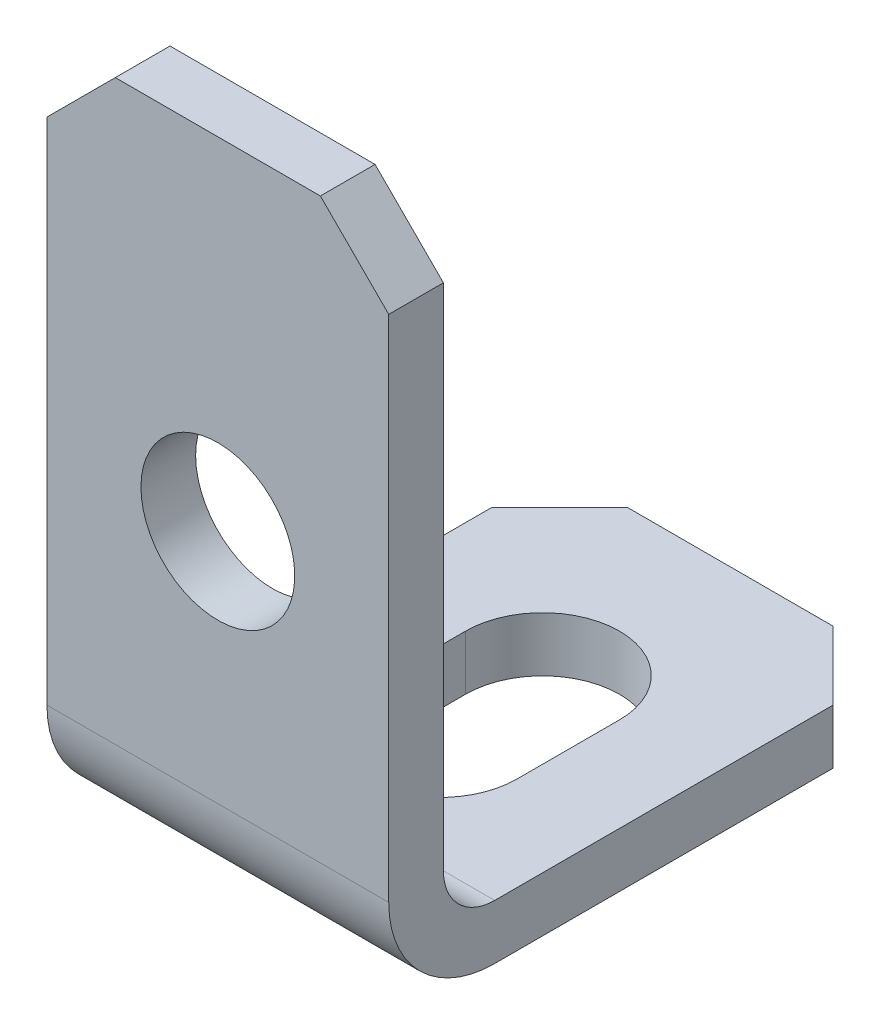
ISO-10303-21;
HEADER;
FILE_DESCRIPTION(('STEP AP214'),'2;1');
FILE_NAME('part.step','',(''),(''),'','','');
FILE_SCHEMA(('AUTOMOTIVE_DESIGN { 1 0 10303 214 1 1 1 1 }'));
ENDSEC;
DATA;
#1=APPLICATION_CONTEXT('core data for automotive mechanical design processes');
#2=APPLICATION_PROTOCOL_DEFINITION('international standard','automotive_design',2000,#1);
#3=PRODUCT_CONTEXT('',#1,'mechanical');
#4=PRODUCT('Part','Part','',(#3));
#5=PRODUCT_RELATED_PRODUCT_CATEGORY('part','',(#4));
#6=PRODUCT_DEFINITION_FORMATION('','',#4);
#7=PRODUCT_DEFINITION_CONTEXT('part definition',#1,'design');
#8=PRODUCT_DEFINITION('design','',#6,#7);
#9=PRODUCT_DEFINITION_SHAPE('','',#8);
#10=(LENGTH_UNIT() NAMED_UNIT(*) SI_UNIT(.MILLI.,.METRE.));
#11=(NAMED_UNIT(*) PLANE_ANGLE_UNIT() SI_UNIT($,.RADIAN.));
#12=(NAMED_UNIT(*) SI_UNIT($,.STERADIAN.) SOLID_ANGLE_UNIT());
#13=UNCERTAINTY_MEASURE_WITH_UNIT(LENGTH_MEASURE(1.E-05),#10,'distance_accuracy_value','');
#14=(GEOMETRIC_REPRESENTATION_CONTEXT(3) GLOBAL_UNCERTAINTY_ASSIGNED_CONTEXT((#13)) GLOBAL_UNIT_ASSIGNED_CONTEXT((#10,
#11,#12)) REPRESENTATION_CONTEXT('',''));
#15=CARTESIAN_POINT('',(0.,0.,0.));
#16=DIRECTION('',(0.,0.,1.));
#17=DIRECTION('',(1.,0.,0.));
#18=AXIS2_PLACEMENT_3D('',#15,#16,#17);
#19=CARTESIAN_POINT('',(0.,20.,-15.));
#20=DIRECTION('',(0.,1.,0.));
#21=DIRECTION('',(0.,0.,1.));
#22=AXIS2_PLACEMENT_3D('',#19,#20,#21);
#23=PLANE('',#22);
#24=DIRECTION('',(-1.,0.,0.));
#25=VECTOR('',#24,1.);
#26=CARTESIAN_POINT('',(10.,20.,-1.6));
#27=LINE('',#26,#25);
#28=CARTESIAN_POINT('',(7.99999999999999,20.,-1.6));
#29=VERTEX_POINT('',#28);
#30=CARTESIAN_POINT('',(2.,20.,-1.6));
#31=VERTEX_POINT('',#30);
#32=EDGE_CURVE('E188',#29,#31,#27,.T.);
#33=ORIENTED_EDGE('',*,*,#32,.T.);
#34=DIRECTION('',(0.,0.,1.));
#35=VECTOR('',#34,1.);
#36=CARTESIAN_POINT('',(1.99999999999999,20.,0.));
#37=LINE('',#36,#35);
#38=CARTESIAN_POINT('',(1.99999999999999,20.,0.));
#39=VERTEX_POINT('',#38);
#40=EDGE_CURVE('E219',#31,#39,#37,.T.);
#41=ORIENTED_EDGE('',*,*,#40,.T.);
#42=DIRECTION('',(1.,0.,0.));
#43=VECTOR('',#42,1.);
#44=CARTESIAN_POINT('',(0.,20.,0.));
#45=LINE('',#44,#43);
#46=CARTESIAN_POINT('',(7.99999999999999,20.,0.));
#47=VERTEX_POINT('',#46);
#48=EDGE_CURVE('E200',#39,#47,#45,.T.);
#49=ORIENTED_EDGE('',*,*,#48,.T.);
#50=DIRECTION('',(0.,0.,-1.));
#51=VECTOR('',#50,1.);
#52=CARTESIAN_POINT('',(7.99999999999999,20.,-15.));
#53=LINE('',#52,#51);
#54=EDGE_CURVE('E217',#47,#29,#53,.T.);
#55=ORIENTED_EDGE('',*,*,#54,.T.);
#56=EDGE_LOOP('',(#33,#41,#49,#55));
#57=FACE_BOUND('',#56,.T.);
#58=ADVANCED_FACE('F32',(#57),#23,.T.);
#59=CARTESIAN_POINT('',(0.,0.,-15.));
#60=DIRECTION('',(0.,0.,-1.));
#61=DIRECTION('',(-1.,0.,0.));
#62=AXIS2_PLACEMENT_3D('',#59,#60,#61);
#63=PLANE('',#62);
#64=DIRECTION('',(1.,0.,0.));
#65=VECTOR('',#64,1.);
#66=CARTESIAN_POINT('',(0.,0.,-15.));
#67=LINE('',#66,#65);
#68=CARTESIAN_POINT('',(1.99999999999999,0.,-15.));
#69=VERTEX_POINT('',#68);
#70=CARTESIAN_POINT('',(7.99999999999999,0.,-15.));
#71=VERTEX_POINT('',#70);
#72=EDGE_CURVE('E203',#69,#71,#67,.T.);
#73=ORIENTED_EDGE('',*,*,#72,.F.);
#74=DIRECTION('',(0.,1.,0.));
#75=VECTOR('',#74,1.);
#76=CARTESIAN_POINT('',(1.99999999999999,1.6,-15.));
#77=LINE('',#76,#75);
#78=CARTESIAN_POINT('',(2.,1.6,-15.));
#79=VERTEX_POINT('',#78);
#80=EDGE_CURVE('E239',#69,#79,#77,.T.);
#81=ORIENTED_EDGE('',*,*,#80,.T.);
#82=DIRECTION('',(-1.,0.,0.));
#83=VECTOR('',#82,1.);
#84=CARTESIAN_POINT('',(10.,1.6,-15.));
#85=LINE('',#84,#83);
#86=CARTESIAN_POINT('',(7.99999999999999,1.6,-15.));
#87=VERTEX_POINT('',#86);
#88=EDGE_CURVE('E184',#87,#79,#85,.T.);
#89=ORIENTED_EDGE('',*,*,#88,.F.);
#90=DIRECTION('',(0.,-1.,0.));
#91=VECTOR('',#90,1.);
#92=CARTESIAN_POINT('',(7.99999999999999,0.,-15.));
#93=LINE('',#92,#91);
#94=EDGE_CURVE('E237',#87,#71,#93,.T.);
#95=ORIENTED_EDGE('',*,*,#94,.T.);
#96=EDGE_LOOP('',(#73,#81,#89,#95));
#97=FACE_BOUND('',#96,.T.);
#98=ADVANCED_FACE('F301',(#97),#63,.T.);
#99=CARTESIAN_POINT('',(0.,0.,0.));
#100=DIRECTION('',(0.,-1.,0.));
#101=DIRECTION('',(0.,0.,-1.));
#102=AXIS2_PLACEMENT_3D('',#99,#100,#101);
#103=PLANE('',#102);
#104=CARTESIAN_POINT('',(5.,0.,-9.5));
#105=DIRECTION('',(0.,-1.,0.));
#106=DIRECTION('',(0.,0.,-1.));
#107=AXIS2_PLACEMENT_3D('',#104,#105,#106);
#108=CIRCLE('',#107,2.25);
#109=CARTESIAN_POINT('',(2.75,0.,-9.5));
#110=VERTEX_POINT('',#109);
#111=CARTESIAN_POINT('',(7.25,0.,-9.5));
#112=VERTEX_POINT('',#111);
#113=EDGE_CURVE('E164',#110,#112,#108,.T.);
#114=ORIENTED_EDGE('',*,*,#113,.F.);
#115=DIRECTION('',(0.,0.,-1.));
#116=VECTOR('',#115,1.);
#117=CARTESIAN_POINT('',(2.75,0.,-6.5));
#118=LINE('',#117,#116);
#119=CARTESIAN_POINT('',(2.75,0.,-6.5));
#120=VERTEX_POINT('',#119);
#121=EDGE_CURVE('E168',#120,#110,#118,.T.);
#122=ORIENTED_EDGE('',*,*,#121,.F.);
#123=CARTESIAN_POINT('',(5.,0.,-6.5));
#124=DIRECTION('',(0.,-1.,0.));
#125=DIRECTION('',(0.,0.,-1.));
#126=AXIS2_PLACEMENT_3D('',#123,#124,#125);
#127=CIRCLE('',#126,2.25);
#128=CARTESIAN_POINT('',(7.25,0.,-6.5));
#129=VERTEX_POINT('',#128);
#130=EDGE_CURVE('E148',#129,#120,#127,.T.);
#131=ORIENTED_EDGE('',*,*,#130,.F.);
#132=DIRECTION('',(0.,0.,1.));
#133=VECTOR('',#132,1.);
#134=CARTESIAN_POINT('',(7.25,0.,-9.5));
#135=LINE('',#134,#133);
#136=EDGE_CURVE('E159',#112,#129,#135,.T.);
#137=ORIENTED_EDGE('',*,*,#136,.F.);
#138=EDGE_LOOP('',(#114,#122,#131,#137));
#139=FACE_BOUND('',#138,.T.);
#140=DIRECTION('',(0.,0.,-1.));
#141=VECTOR('',#140,1.);
#142=CARTESIAN_POINT('',(10.,0.,0.));
#143=LINE('',#142,#141);
#144=CARTESIAN_POINT('',(10.,0.,-3.1));
#145=VERTEX_POINT('',#144);
#146=CARTESIAN_POINT('',(10.,0.,-13.));
#147=VERTEX_POINT('',#146);
#148=EDGE_CURVE('E198',#145,#147,#143,.T.);
#149=ORIENTED_EDGE('',*,*,#148,.F.);
#150=DIRECTION('',(1.,0.,0.));
#151=VECTOR('',#150,1.);
#152=CARTESIAN_POINT('',(0.,0.,-3.1));
#153=LINE('',#152,#151);
#154=CARTESIAN_POINT('',(0.,0.,-3.1));
#155=VERTEX_POINT('',#154);
#156=EDGE_CURVE('E40',#145,#155,#153,.F.);
#157=ORIENTED_EDGE('',*,*,#156,.T.);
#158=DIRECTION('',(0.,0.,-1.));
#159=VECTOR('',#158,1.);
#160=CARTESIAN_POINT('',(0.,0.,0.));
#161=LINE('',#160,#159);
#162=CARTESIAN_POINT('',(0.,0.,-13.));
#163=VERTEX_POINT('',#162);
#164=EDGE_CURVE('E197',#155,#163,#161,.T.);
#165=ORIENTED_EDGE('',*,*,#164,.T.);
#166=DIRECTION('',(0.707106781186545,0.,-0.70710678118655));
#167=VECTOR('',#166,1.);
#168=CARTESIAN_POINT('',(-6.5,0.,-6.49999999999995));
#169=LINE('',#168,#167);
#170=EDGE_CURVE('E249',#163,#69,#169,.T.);
#171=ORIENTED_EDGE('',*,*,#170,.T.);
#172=ORIENTED_EDGE('',*,*,#72,.T.);
#173=DIRECTION('',(-0.70710678118655,0.,-0.707106781186545));
#174=VECTOR('',#173,1.);
#175=CARTESIAN_POINT('',(11.5,0.,-11.5));
#176=LINE('',#175,#174);
#177=EDGE_CURVE('E246',#71,#147,#176,.F.);
#178=ORIENTED_EDGE('',*,*,#177,.T.);
#179=EDGE_LOOP('',(#149,#157,#165,#171,#172,#178));
#180=FACE_BOUND('',#179,.T.);
#181=ADVANCED_FACE('F166',(#139,#180),#103,.T.);
#182=CARTESIAN_POINT('',(0.,20.,0.));
#183=DIRECTION('',(0.,0.,1.));
#184=DIRECTION('',(1.,0.,0.));
#185=AXIS2_PLACEMENT_3D('',#182,#183,#184);
#186=PLANE('',#185);
#187=CARTESIAN_POINT('',(5.,10.,0.));
#188=DIRECTION('',(0.,0.,-1.));
#189=DIRECTION('',(-1.,0.,0.));
#190=AXIS2_PLACEMENT_3D('',#187,#188,#189);
#191=CIRCLE('',#190,2.24999999999999);
#192=CARTESIAN_POINT('',(2.75000000000001,10.,0.));
#193=VERTEX_POINT('',#192);
#194=EDGE_CURVE('E466',#193,#193,#191,.T.);
#195=ORIENTED_EDGE('',*,*,#194,.T.);
#196=EDGE_LOOP('',(#195));
#197=FACE_BOUND('',#196,.T.);
#198=DIRECTION('',(0.,-1.,0.));
#199=VECTOR('',#198,1.);
#200=CARTESIAN_POINT('',(0.,20.,0.));
#201=LINE('',#200,#199);
#202=CARTESIAN_POINT('',(0.,18.,0.));
#203=VERTEX_POINT('',#202);
#204=CARTESIAN_POINT('',(0.,3.1,0.));
#205=VERTEX_POINT('',#204);
#206=EDGE_CURVE('E194',#203,#205,#201,.T.);
#207=ORIENTED_EDGE('',*,*,#206,.T.);
#208=DIRECTION('',(1.,0.,0.));
#209=VECTOR('',#208,1.);
#210=CARTESIAN_POINT('',(0.,3.1,0.));
#211=LINE('',#210,#209);
#212=CARTESIAN_POINT('',(10.,3.1,0.));
#213=VERTEX_POINT('',#212);
#214=EDGE_CURVE('E266',#205,#213,#211,.T.);
#215=ORIENTED_EDGE('',*,*,#214,.T.);
#216=DIRECTION('',(0.,-1.,0.));
#217=VECTOR('',#216,1.);
#218=CARTESIAN_POINT('',(10.,20.,0.));
#219=LINE('',#218,#217);
#220=CARTESIAN_POINT('',(10.,18.,0.));
#221=VERTEX_POINT('',#220);
#222=EDGE_CURVE('E191',#221,#213,#219,.T.);
#223=ORIENTED_EDGE('',*,*,#222,.F.);
#224=DIRECTION('',(0.70710678118655,-0.707106781186545,0.));
#225=VECTOR('',#224,1.);
#226=CARTESIAN_POINT('',(3.99999999999997,24.,0.));
#227=LINE('',#226,#225);
#228=EDGE_CURVE('E222',#221,#47,#227,.F.);
#229=ORIENTED_EDGE('',*,*,#228,.T.);
#230=ORIENTED_EDGE('',*,*,#48,.F.);
#231=DIRECTION('',(-0.707106781186545,-0.70710678118655,0.));
#232=VECTOR('',#231,1.);
#233=CARTESIAN_POINT('',(1.,19.,0.));
#234=LINE('',#233,#232);
#235=EDGE_CURVE('E224',#39,#203,#234,.T.);
#236=ORIENTED_EDGE('',*,*,#235,.T.);
#237=EDGE_LOOP('',(#207,#215,#223,#229,#230,#236));
#238=FACE_BOUND('',#237,.T.);
#239=ADVANCED_FACE('F272',(#197,#238),#186,.T.);
#240=CARTESIAN_POINT('',(0.,0.,0.));
#241=DIRECTION('',(1.,0.,0.));
#242=DIRECTION('',(0.,0.,-1.));
#243=AXIS2_PLACEMENT_3D('',#240,#241,#242);
#244=PLANE('',#243);
#245=ORIENTED_EDGE('',*,*,#164,.F.);
#246=CARTESIAN_POINT('',(0.,3.1,-3.1));
#247=DIRECTION('',(1.,0.,0.));
#248=DIRECTION('',(0.,0.,-1.));
#249=AXIS2_PLACEMENT_3D('',#246,#247,#248);
#250=CIRCLE('',#249,3.1);
#251=EDGE_CURVE('E11',#155,#205,#250,.F.);
#252=ORIENTED_EDGE('',*,*,#251,.T.);
#253=ORIENTED_EDGE('',*,*,#206,.F.);
#254=DIRECTION('',(0.,0.,-1.));
#255=VECTOR('',#254,1.);
#256=CARTESIAN_POINT('',(0.,18.,-1.6));
#257=LINE('',#256,#255);
#258=CARTESIAN_POINT('',(0.,18.,-1.6));
#259=VERTEX_POINT('',#258);
#260=EDGE_CURVE('E229',#203,#259,#257,.T.);
#261=ORIENTED_EDGE('',*,*,#260,.T.);
#262=DIRECTION('',(0.,1.,0.));
#263=VECTOR('',#262,1.);
#264=CARTESIAN_POINT('',(0.,1.6,-1.6));
#265=LINE('',#264,#263);
#266=CARTESIAN_POINT('',(0.,3.1,-1.6));
#267=VERTEX_POINT('',#266);
#268=EDGE_CURVE('E182',#267,#259,#265,.T.);
#269=ORIENTED_EDGE('',*,*,#268,.F.);
#270=CARTESIAN_POINT('',(0.,3.1,-3.1));
#271=DIRECTION('',(1.,0.,0.));
#272=DIRECTION('',(0.,0.,-1.));
#273=AXIS2_PLACEMENT_3D('',#270,#271,#272);
#274=CIRCLE('',#273,1.5);
#275=CARTESIAN_POINT('',(0.,1.6,-3.1));
#276=VERTEX_POINT('',#275);
#277=EDGE_CURVE('E262',#267,#276,#274,.T.);
#278=ORIENTED_EDGE('',*,*,#277,.T.);
#279=DIRECTION('',(0.,0.,1.));
#280=VECTOR('',#279,1.);
#281=CARTESIAN_POINT('',(0.,1.6,-15.));
#282=LINE('',#281,#280);
#283=CARTESIAN_POINT('',(0.,1.6,-13.));
#284=VERTEX_POINT('',#283);
#285=EDGE_CURVE('E175',#284,#276,#282,.T.);
#286=ORIENTED_EDGE('',*,*,#285,.F.);
#287=DIRECTION('',(0.,-1.,0.));
#288=VECTOR('',#287,1.);
#289=CARTESIAN_POINT('',(0.,0.,-13.));
#290=LINE('',#289,#288);
#291=EDGE_CURVE('E226',#284,#163,#290,.T.);
#292=ORIENTED_EDGE('',*,*,#291,.T.);
#293=EDGE_LOOP('',(#245,#252,#253,#261,#269,#278,#286,#292));
#294=FACE_BOUND('',#293,.T.);
#295=ADVANCED_FACE('F292',(#294),#244,.F.);
#296=CARTESIAN_POINT('',(10.,0.,0.));
#297=DIRECTION('',(1.,0.,0.));
#298=DIRECTION('',(0.,0.,-1.));
#299=AXIS2_PLACEMENT_3D('',#296,#297,#298);
#300=PLANE('',#299);
#301=ORIENTED_EDGE('',*,*,#222,.T.);
#302=CARTESIAN_POINT('',(10.,3.1,-3.1));
#303=DIRECTION('',(1.,0.,0.));
#304=DIRECTION('',(0.,0.,-1.));
#305=AXIS2_PLACEMENT_3D('',#302,#303,#304);
#306=CIRCLE('',#305,3.1);
#307=EDGE_CURVE('E54',#213,#145,#306,.T.);
#308=ORIENTED_EDGE('',*,*,#307,.T.);
#309=ORIENTED_EDGE('',*,*,#148,.T.);
#310=DIRECTION('',(0.,1.,0.));
#311=VECTOR('',#310,1.);
#312=CARTESIAN_POINT('',(10.,0.,-13.));
#313=LINE('',#312,#311);
#314=CARTESIAN_POINT('',(10.,1.6,-13.));
#315=VERTEX_POINT('',#314);
#316=EDGE_CURVE('E254',#147,#315,#313,.T.);
#317=ORIENTED_EDGE('',*,*,#316,.T.);
#318=DIRECTION('',(0.,0.,1.));
#319=VECTOR('',#318,1.);
#320=CARTESIAN_POINT('',(10.,1.6,-15.));
#321=LINE('',#320,#319);
#322=CARTESIAN_POINT('',(10.,1.6,-3.1));
#323=VERTEX_POINT('',#322);
#324=EDGE_CURVE('E178',#315,#323,#321,.T.);
#325=ORIENTED_EDGE('',*,*,#324,.T.);
#326=CARTESIAN_POINT('',(10.,3.1,-3.1));
#327=DIRECTION('',(1.,0.,0.));
#328=DIRECTION('',(0.,0.,-1.));
#329=AXIS2_PLACEMENT_3D('',#326,#327,#328);
#330=CIRCLE('',#329,1.5);
#331=CARTESIAN_POINT('',(10.,3.1,-1.6));
#332=VERTEX_POINT('',#331);
#333=EDGE_CURVE('E264',#323,#332,#330,.F.);
#334=ORIENTED_EDGE('',*,*,#333,.T.);
#335=DIRECTION('',(0.,1.,0.));
#336=VECTOR('',#335,1.);
#337=CARTESIAN_POINT('',(10.,1.6,-1.6));
#338=LINE('',#337,#336);
#339=CARTESIAN_POINT('',(10.,18.,-1.6));
#340=VERTEX_POINT('',#339);
#341=EDGE_CURVE('E181',#332,#340,#338,.T.);
#342=ORIENTED_EDGE('',*,*,#341,.T.);
#343=DIRECTION('',(0.,0.,1.));
#344=VECTOR('',#343,1.);
#345=CARTESIAN_POINT('',(10.,18.,0.));
#346=LINE('',#345,#344);
#347=EDGE_CURVE('E251',#340,#221,#346,.T.);
#348=ORIENTED_EDGE('',*,*,#347,.T.);
#349=EDGE_LOOP('',(#301,#308,#309,#317,#325,#334,#342,#348));
#350=FACE_BOUND('',#349,.T.);
#351=ADVANCED_FACE('F276',(#350),#300,.T.);
#352=CARTESIAN_POINT('',(10.,1.6,-1.6));
#353=DIRECTION('',(0.,0.,1.));
#354=DIRECTION('',(1.,0.,0.));
#355=AXIS2_PLACEMENT_3D('',#352,#353,#354);
#356=PLANE('',#355);
#357=CARTESIAN_POINT('',(5.,10.,-1.6));
#358=DIRECTION('',(0.,0.,-1.));
#359=DIRECTION('',(-1.,0.,0.));
#360=AXIS2_PLACEMENT_3D('',#357,#358,#359);
#361=CIRCLE('',#360,2.24999999999999);
#362=CARTESIAN_POINT('',(2.75000000000001,10.,-1.6));
#363=VERTEX_POINT('',#362);
#364=EDGE_CURVE('E469',#363,#363,#361,.T.);
#365=ORIENTED_EDGE('',*,*,#364,.F.);
#366=EDGE_LOOP('',(#365));
#367=FACE_BOUND('',#366,.T.);
#368=ORIENTED_EDGE('',*,*,#341,.F.);
#369=DIRECTION('',(-1.,0.,0.));
#370=VECTOR('',#369,1.);
#371=CARTESIAN_POINT('',(0.,3.1,-1.6));
#372=LINE('',#371,#370);
#373=EDGE_CURVE('E257',#332,#267,#372,.T.);
#374=ORIENTED_EDGE('',*,*,#373,.T.);
#375=ORIENTED_EDGE('',*,*,#268,.T.);
#376=DIRECTION('',(0.707106781186545,0.70710678118655,0.));
#377=VECTOR('',#376,1.);
#378=CARTESIAN_POINT('',(1.99999999999999,20.,-1.6));
#379=LINE('',#378,#377);
#380=EDGE_CURVE('E235',#259,#31,#379,.T.);
#381=ORIENTED_EDGE('',*,*,#380,.T.);
#382=ORIENTED_EDGE('',*,*,#32,.F.);
#383=DIRECTION('',(-0.70710678118655,0.707106781186545,0.));
#384=VECTOR('',#383,1.);
#385=CARTESIAN_POINT('',(10.,18.,-1.6));
#386=LINE('',#385,#384);
#387=EDGE_CURVE('E232',#29,#340,#386,.F.);
#388=ORIENTED_EDGE('',*,*,#387,.T.);
#389=EDGE_LOOP('',(#368,#374,#375,#381,#382,#388));
#390=FACE_BOUND('',#389,.T.);
#391=ADVANCED_FACE('F370',(#367,#390),#356,.F.);
#392=CARTESIAN_POINT('',(10.,1.6,-15.));
#393=DIRECTION('',(0.,-1.,0.));
#394=DIRECTION('',(0.,0.,-1.));
#395=AXIS2_PLACEMENT_3D('',#392,#393,#394);
#396=PLANE('',#395);
#397=DIRECTION('',(0.,0.,-1.));
#398=VECTOR('',#397,1.);
#399=CARTESIAN_POINT('',(2.75,1.6,-15.));
#400=LINE('',#399,#398);
#401=CARTESIAN_POINT('',(2.75,1.6,-6.5));
#402=VERTEX_POINT('',#401);
#403=CARTESIAN_POINT('',(2.75,1.6,-9.5));
#404=VERTEX_POINT('',#403);
#405=EDGE_CURVE('E211',#402,#404,#400,.T.);
#406=ORIENTED_EDGE('',*,*,#405,.T.);
#407=CARTESIAN_POINT('',(5.,1.6,-9.5));
#408=DIRECTION('',(0.,-1.,0.));
#409=DIRECTION('',(0.,0.,-1.));
#410=AXIS2_PLACEMENT_3D('',#407,#408,#409);
#411=CIRCLE('',#410,2.25);
#412=CARTESIAN_POINT('',(7.25,1.6,-9.5));
#413=VERTEX_POINT('',#412);
#414=EDGE_CURVE('E214',#404,#413,#411,.T.);
#415=ORIENTED_EDGE('',*,*,#414,.T.);
#416=DIRECTION('',(0.,0.,1.));
#417=VECTOR('',#416,1.);
#418=CARTESIAN_POINT('',(7.25,1.6,-15.));
#419=LINE('',#418,#417);
#420=CARTESIAN_POINT('',(7.25,1.6,-6.5));
#421=VERTEX_POINT('',#420);
#422=EDGE_CURVE('E206',#413,#421,#419,.T.);
#423=ORIENTED_EDGE('',*,*,#422,.T.);
#424=CARTESIAN_POINT('',(5.,1.6,-6.5));
#425=DIRECTION('',(0.,-1.,0.));
#426=DIRECTION('',(0.,0.,-1.));
#427=AXIS2_PLACEMENT_3D('',#424,#425,#426);
#428=CIRCLE('',#427,2.25);
#429=EDGE_CURVE('E151',#421,#402,#428,.T.);
#430=ORIENTED_EDGE('',*,*,#429,.T.);
#431=EDGE_LOOP('',(#406,#415,#423,#430));
#432=FACE_BOUND('',#431,.T.);
#433=ORIENTED_EDGE('',*,*,#285,.T.);
#434=DIRECTION('',(-1.,0.,0.));
#435=VECTOR('',#434,1.);
#436=CARTESIAN_POINT('',(10.,1.6,-3.1));
#437=LINE('',#436,#435);
#438=EDGE_CURVE('E260',#276,#323,#437,.F.);
#439=ORIENTED_EDGE('',*,*,#438,.T.);
#440=ORIENTED_EDGE('',*,*,#324,.F.);
#441=DIRECTION('',(0.70710678118655,0.,0.707106781186545));
#442=VECTOR('',#441,1.);
#443=CARTESIAN_POINT('',(10.,1.6,-13.));
#444=LINE('',#443,#442);
#445=EDGE_CURVE('E242',#315,#87,#444,.F.);
#446=ORIENTED_EDGE('',*,*,#445,.T.);
#447=ORIENTED_EDGE('',*,*,#88,.T.);
#448=DIRECTION('',(-0.707106781186545,0.,0.70710678118655));
#449=VECTOR('',#448,1.);
#450=CARTESIAN_POINT('',(1.99999999999999,1.6,-15.));
#451=LINE('',#450,#449);
#452=EDGE_CURVE('E244',#79,#284,#451,.T.);
#453=ORIENTED_EDGE('',*,*,#452,.T.);
#454=EDGE_LOOP('',(#433,#439,#440,#446,#447,#453));
#455=FACE_BOUND('',#454,.T.);
#456=ADVANCED_FACE('F339',(#432,#455),#396,.F.);
#457=CARTESIAN_POINT('',(5.,20.,-9.5));
#458=DIRECTION('',(0.,-1.,0.));
#459=DIRECTION('',(0.,0.,-1.));
#460=AXIS2_PLACEMENT_3D('',#457,#458,#459);
#461=CYLINDRICAL_SURFACE('',#460,2.25);
#462=DIRECTION('',(0.,-1.,0.));
#463=VECTOR('',#462,1.);
#464=CARTESIAN_POINT('',(2.75,20.,-9.5));
#465=LINE('',#464,#463);
#466=EDGE_CURVE('E173',#404,#110,#465,.T.);
#467=ORIENTED_EDGE('',*,*,#466,.T.);
#468=ORIENTED_EDGE('',*,*,#113,.T.);
#469=DIRECTION('',(0.,-1.,0.));
#470=VECTOR('',#469,1.);
#471=CARTESIAN_POINT('',(7.25,20.,-9.5));
#472=LINE('',#471,#470);
#473=EDGE_CURVE('E155',#413,#112,#472,.T.);
#474=ORIENTED_EDGE('',*,*,#473,.F.);
#475=ORIENTED_EDGE('',*,*,#414,.F.);
#476=EDGE_LOOP('',(#467,#468,#474,#475));
#477=FACE_BOUND('',#476,.T.);
#478=ADVANCED_FACE('F386',(#477),#461,.F.);
#479=CARTESIAN_POINT('',(2.75,20.,-6.5));
#480=DIRECTION('',(-1.,0.,0.));
#481=DIRECTION('',(0.,0.,1.));
#482=AXIS2_PLACEMENT_3D('',#479,#480,#481);
#483=PLANE('',#482);
#484=DIRECTION('',(0.,-1.,0.));
#485=VECTOR('',#484,1.);
#486=CARTESIAN_POINT('',(2.75,20.,-6.5));
#487=LINE('',#486,#485);
#488=EDGE_CURVE('E154',#402,#120,#487,.T.);
#489=ORIENTED_EDGE('',*,*,#488,.T.);
#490=ORIENTED_EDGE('',*,*,#121,.T.);
#491=ORIENTED_EDGE('',*,*,#466,.F.);
#492=ORIENTED_EDGE('',*,*,#405,.F.);
#493=EDGE_LOOP('',(#489,#490,#491,#492));
#494=FACE_BOUND('',#493,.T.);
#495=ADVANCED_FACE('F392',(#494),#483,.F.);
#496=CARTESIAN_POINT('',(5.,20.,-6.5));
#497=DIRECTION('',(0.,-1.,0.));
#498=DIRECTION('',(0.,0.,-1.));
#499=AXIS2_PLACEMENT_3D('',#496,#497,#498);
#500=CYLINDRICAL_SURFACE('',#499,2.25);
#501=DIRECTION('',(0.,-1.,0.));
#502=VECTOR('',#501,1.);
#503=CARTESIAN_POINT('',(7.25,20.,-6.5));
#504=LINE('',#503,#502);
#505=EDGE_CURVE('E143',#421,#129,#504,.T.);
#506=ORIENTED_EDGE('',*,*,#505,.T.);
#507=ORIENTED_EDGE('',*,*,#130,.T.);
#508=ORIENTED_EDGE('',*,*,#488,.F.);
#509=ORIENTED_EDGE('',*,*,#429,.F.);
#510=EDGE_LOOP('',(#506,#507,#508,#509));
#511=FACE_BOUND('',#510,.T.);
#512=ADVANCED_FACE('F145',(#511),#500,.F.);
#513=CARTESIAN_POINT('',(7.25,20.,-9.5));
#514=DIRECTION('',(1.,0.,0.));
#515=DIRECTION('',(0.,0.,-1.));
#516=AXIS2_PLACEMENT_3D('',#513,#514,#515);
#517=PLANE('',#516);
#518=ORIENTED_EDGE('',*,*,#473,.T.);
#519=ORIENTED_EDGE('',*,*,#136,.T.);
#520=ORIENTED_EDGE('',*,*,#505,.F.);
#521=ORIENTED_EDGE('',*,*,#422,.F.);
#522=EDGE_LOOP('',(#518,#519,#520,#521));
#523=FACE_BOUND('',#522,.T.);
#524=ADVANCED_FACE('F160',(#523),#517,.F.);
#525=CARTESIAN_POINT('',(5.,10.,-1.6));
#526=DIRECTION('',(0.,0.,-1.));
#527=DIRECTION('',(-1.,0.,0.));
#528=AXIS2_PLACEMENT_3D('',#525,#526,#527);
#529=CYLINDRICAL_SURFACE('',#528,2.24999999999999);
#530=ORIENTED_EDGE('',*,*,#194,.F.);
#531=EDGE_LOOP('',(#530));
#532=FACE_BOUND('',#531,.T.);
#533=ORIENTED_EDGE('',*,*,#364,.T.);
#534=EDGE_LOOP('',(#533));
#535=FACE_BOUND('',#534,.T.);
#536=ADVANCED_FACE('F314',(#532,#535),#529,.F.);
#537=CARTESIAN_POINT('',(1.99999999999999,20.,-15.));
#538=DIRECTION('',(-0.70710678118655,0.707106781186545,0.));
#539=DIRECTION('',(0.,0.,-1.));
#540=AXIS2_PLACEMENT_3D('',#537,#538,#539);
#541=PLANE('',#540);
#542=ORIENTED_EDGE('',*,*,#380,.F.);
#543=ORIENTED_EDGE('',*,*,#260,.F.);
#544=ORIENTED_EDGE('',*,*,#235,.F.);
#545=ORIENTED_EDGE('',*,*,#40,.F.);
#546=EDGE_LOOP('',(#542,#543,#544,#545));
#547=FACE_BOUND('',#546,.T.);
#548=ADVANCED_FACE('F289',(#547),#541,.T.);
#549=CARTESIAN_POINT('',(1.99999999999999,0.,-15.));
#550=DIRECTION('',(-0.70710678118655,0.,-0.707106781186545));
#551=DIRECTION('',(0.,-1.,0.));
#552=AXIS2_PLACEMENT_3D('',#549,#550,#551);
#553=PLANE('',#552);
#554=ORIENTED_EDGE('',*,*,#170,.F.);
#555=ORIENTED_EDGE('',*,*,#291,.F.);
#556=ORIENTED_EDGE('',*,*,#452,.F.);
#557=ORIENTED_EDGE('',*,*,#80,.F.);
#558=EDGE_LOOP('',(#554,#555,#556,#557));
#559=FACE_BOUND('',#558,.T.);
#560=ADVANCED_FACE('F313',(#559),#553,.T.);
#561=CARTESIAN_POINT('',(10.,0.,-13.));
#562=DIRECTION('',(-0.707106781186545,0.,0.70710678118655));
#563=DIRECTION('',(0.,1.,0.));
#564=AXIS2_PLACEMENT_3D('',#561,#562,#563);
#565=PLANE('',#564);
#566=ORIENTED_EDGE('',*,*,#177,.F.);
#567=ORIENTED_EDGE('',*,*,#94,.F.);
#568=ORIENTED_EDGE('',*,*,#445,.F.);
#569=ORIENTED_EDGE('',*,*,#316,.F.);
#570=EDGE_LOOP('',(#566,#567,#568,#569));
#571=FACE_BOUND('',#570,.T.);
#572=ADVANCED_FACE('F317',(#571),#565,.F.);
#573=CARTESIAN_POINT('',(10.,18.,0.));
#574=DIRECTION('',(-0.707106781186545,-0.70710678118655,0.));
#575=DIRECTION('',(0.,0.,1.));
#576=AXIS2_PLACEMENT_3D('',#573,#574,#575);
#577=PLANE('',#576);
#578=ORIENTED_EDGE('',*,*,#387,.F.);
#579=ORIENTED_EDGE('',*,*,#54,.F.);
#580=ORIENTED_EDGE('',*,*,#228,.F.);
#581=ORIENTED_EDGE('',*,*,#347,.F.);
#582=EDGE_LOOP('',(#578,#579,#580,#581));
#583=FACE_BOUND('',#582,.T.);
#584=ADVANCED_FACE('F281',(#583),#577,.F.);
#585=CARTESIAN_POINT('',(10.,3.1,-3.1));
#586=DIRECTION('',(1.,0.,0.));
#587=DIRECTION('',(0.,0.,-1.));
#588=AXIS2_PLACEMENT_3D('',#585,#586,#587);
#589=CYLINDRICAL_SURFACE('',#588,1.5);
#590=ORIENTED_EDGE('',*,*,#333,.F.);
#591=ORIENTED_EDGE('',*,*,#438,.F.);
#592=ORIENTED_EDGE('',*,*,#277,.F.);
#593=ORIENTED_EDGE('',*,*,#373,.F.);
#594=EDGE_LOOP('',(#590,#591,#592,#593));
#595=FACE_BOUND('',#594,.T.);
#596=ADVANCED_FACE('F295',(#595),#589,.F.);
#597=CARTESIAN_POINT('',(0.,3.1,-3.1));
#598=DIRECTION('',(1.,0.,0.));
#599=DIRECTION('',(0.,0.,-1.));
#600=AXIS2_PLACEMENT_3D('',#597,#598,#599);
#601=CYLINDRICAL_SURFACE('',#600,3.1);
#602=ORIENTED_EDGE('',*,*,#251,.F.);
#603=ORIENTED_EDGE('',*,*,#156,.F.);
#604=ORIENTED_EDGE('',*,*,#307,.F.);
#605=ORIENTED_EDGE('',*,*,#214,.F.);
#606=EDGE_LOOP('',(#602,#603,#604,#605));
#607=FACE_BOUND('',#606,.T.);
#608=ADVANCED_FACE('F34',(#607),#601,.T.);
#609=CLOSED_SHELL('',(#58,#98,#181,#239,#295,#351,#391,#456,#478,#495,#512,#524,#536,#548,#560,
#572,#584,#596,#608));
#610=MANIFOLD_SOLID_BREP('B2',#609);
#611=ADVANCED_BREP_SHAPE_REPRESENTATION('',(#18,#610),#14);
#612=SHAPE_DEFINITION_REPRESENTATION(#9,#611);
ENDSEC;
END-ISO-10303-21;
